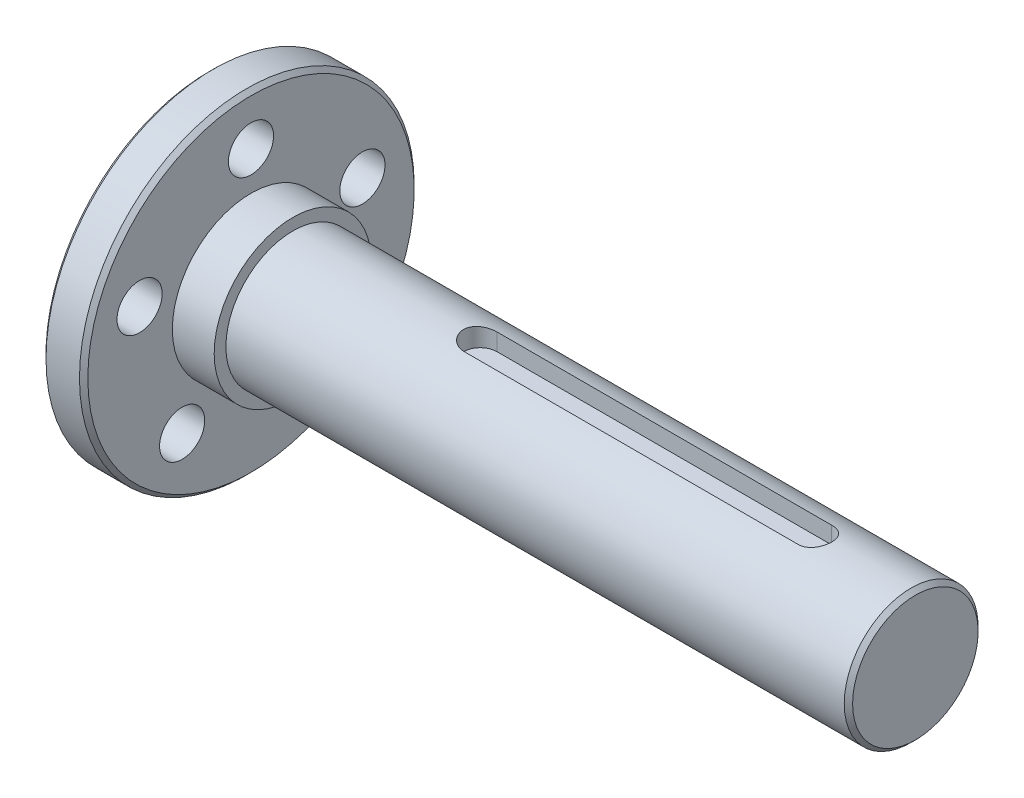
ISO-10303-21;
HEADER;
FILE_DESCRIPTION(('STEP AP214'),'2;1');
FILE_NAME('part.step','',(''),(''),'','','');
FILE_SCHEMA(('AUTOMOTIVE_DESIGN { 1 0 10303 214 1 1 1 1 }'));
ENDSEC;
DATA;
#1=APPLICATION_CONTEXT('core data for automotive mechanical design processes');
#2=APPLICATION_PROTOCOL_DEFINITION('international standard','automotive_design',2000,#1);
#3=PRODUCT_CONTEXT('',#1,'mechanical');
#4=PRODUCT('Part','Part','',(#3));
#5=PRODUCT_RELATED_PRODUCT_CATEGORY('part','',(#4));
#6=PRODUCT_DEFINITION_FORMATION('','',#4);
#7=PRODUCT_DEFINITION_CONTEXT('part definition',#1,'design');
#8=PRODUCT_DEFINITION('design','',#6,#7);
#9=PRODUCT_DEFINITION_SHAPE('','',#8);
#10=(LENGTH_UNIT() NAMED_UNIT(*) SI_UNIT(.MILLI.,.METRE.));
#11=(NAMED_UNIT(*) PLANE_ANGLE_UNIT() SI_UNIT($,.RADIAN.));
#12=(NAMED_UNIT(*) SI_UNIT($,.STERADIAN.) SOLID_ANGLE_UNIT());
#13=UNCERTAINTY_MEASURE_WITH_UNIT(LENGTH_MEASURE(1.E-05),#10,'distance_accuracy_value','');
#14=(GEOMETRIC_REPRESENTATION_CONTEXT(3) GLOBAL_UNCERTAINTY_ASSIGNED_CONTEXT((#13)) GLOBAL_UNIT_ASSIGNED_CONTEXT((#10,
#11,#12)) REPRESENTATION_CONTEXT('',''));
#15=CARTESIAN_POINT('',(0.,0.,0.));
#16=DIRECTION('',(0.,0.,1.));
#17=DIRECTION('',(1.,0.,0.));
#18=AXIS2_PLACEMENT_3D('',#15,#16,#17);
#19=CARTESIAN_POINT('',(5.2,0.,0.));
#20=DIRECTION('',(-1.,0.,0.));
#21=DIRECTION('',(0.,0.,1.));
#22=AXIS2_PLACEMENT_3D('',#19,#20,#21);
#23=PLANE('',#22);
#24=CARTESIAN_POINT('',(5.2,0.,0.));
#25=DIRECTION('',(-1.,0.,0.));
#26=DIRECTION('',(0.,0.,1.));
#27=AXIS2_PLACEMENT_3D('',#24,#25,#26);
#28=CIRCLE('',#27,2.5);
#29=CARTESIAN_POINT('',(5.2,0.,2.5));
#30=VERTEX_POINT('',#29);
#31=EDGE_CURVE('E21',#30,#30,#28,.T.);
#32=ORIENTED_EDGE('',*,*,#31,.T.);
#33=EDGE_LOOP('',(#32));
#34=FACE_BOUND('',#33,.T.);
#35=ADVANCED_FACE('F18',(#34),#23,.T.);
#36=CARTESIAN_POINT('',(5.2,0.,0.));
#37=DIRECTION('',(-1.,0.,0.));
#38=DIRECTION('',(0.,0.,1.));
#39=AXIS2_PLACEMENT_3D('',#36,#37,#38);
#40=CYLINDRICAL_SURFACE('',#39,2.5);
#41=CARTESIAN_POINT('',(0.250000000050932,0.,0.));
#42=DIRECTION('',(-1.,0.,0.));
#43=DIRECTION('',(0.,0.,1.));
#44=AXIS2_PLACEMENT_3D('',#41,#42,#43);
#45=CIRCLE('',#44,2.49999999999773);
#46=CARTESIAN_POINT('',(0.250000000050932,0.,2.49999999999773));
#47=VERTEX_POINT('',#46);
#48=EDGE_CURVE('E112',#47,#47,#45,.T.);
#49=ORIENTED_EDGE('',*,*,#48,.T.);
#50=EDGE_LOOP('',(#49));
#51=FACE_BOUND('',#50,.T.);
#52=ORIENTED_EDGE('',*,*,#31,.F.);
#53=EDGE_LOOP('',(#52));
#54=FACE_BOUND('',#53,.T.);
#55=ADVANCED_FACE('F257',(#51,#54),#40,.F.);
#56=CARTESIAN_POINT('',(0.249999999999995,0.,0.));
#57=DIRECTION('',(1.,0.,0.));
#58=DIRECTION('',(0.,0.,-1.));
#59=AXIS2_PLACEMENT_3D('',#56,#57,#58);
#60=CONICAL_SURFACE('',#59,10.,0.785398163397448);
#61=CARTESIAN_POINT('',(0.,0.,0.));
#62=DIRECTION('',(1.,0.,0.));
#63=DIRECTION('',(0.,0.,-1.));
#64=AXIS2_PLACEMENT_3D('',#61,#62,#63);
#65=CIRCLE('',#64,9.75000000000001);
#66=CARTESIAN_POINT('',(0.,0.,-9.75000000000001));
#67=VERTEX_POINT('',#66);
#68=EDGE_CURVE('E111',#67,#67,#65,.T.);
#69=ORIENTED_EDGE('',*,*,#68,.T.);
#70=EDGE_LOOP('',(#69));
#71=FACE_BOUND('',#70,.T.);
#72=CARTESIAN_POINT('',(0.249999999999995,0.,0.));
#73=DIRECTION('',(-1.,0.,0.));
#74=DIRECTION('',(0.,0.,1.));
#75=AXIS2_PLACEMENT_3D('',#72,#73,#74);
#76=CIRCLE('',#75,10.);
#77=CARTESIAN_POINT('',(0.249999999999995,0.,10.));
#78=VERTEX_POINT('',#77);
#79=EDGE_CURVE('E107',#78,#78,#76,.F.);
#80=ORIENTED_EDGE('',*,*,#79,.F.);
#81=EDGE_LOOP('',(#80));
#82=FACE_BOUND('',#81,.T.);
#83=ADVANCED_FACE('F231',(#71,#82),#60,.T.);
#84=CARTESIAN_POINT('',(-5.6843418860808E-11,0.,0.));
#85=DIRECTION('',(-1.,0.,0.));
#86=DIRECTION('',(0.,0.,1.));
#87=AXIS2_PLACEMENT_3D('',#84,#85,#86);
#88=CONICAL_SURFACE('',#87,2.7500000001055,0.785398163397448);
#89=CARTESIAN_POINT('',(0.,0.,0.));
#90=DIRECTION('',(-1.,0.,0.));
#91=DIRECTION('',(0.,0.,1.));
#92=AXIS2_PLACEMENT_3D('',#89,#90,#91);
#93=CIRCLE('',#92,2.75000000004866);
#94=CARTESIAN_POINT('',(0.,0.,2.75000000004866));
#95=VERTEX_POINT('',#94);
#96=EDGE_CURVE('E106',#95,#95,#93,.T.);
#97=ORIENTED_EDGE('',*,*,#96,.T.);
#98=EDGE_LOOP('',(#97));
#99=FACE_BOUND('',#98,.T.);
#100=ORIENTED_EDGE('',*,*,#48,.F.);
#101=EDGE_LOOP('',(#100));
#102=FACE_BOUND('',#101,.T.);
#103=ADVANCED_FACE('F247',(#99,#102),#88,.F.);
#104=CARTESIAN_POINT('',(2.5,0.,0.));
#105=DIRECTION('',(-1.,0.,0.));
#106=DIRECTION('',(0.,0.,1.));
#107=AXIS2_PLACEMENT_3D('',#104,#105,#106);
#108=CYLINDRICAL_SURFACE('',#107,10.);
#109=ORIENTED_EDGE('',*,*,#79,.T.);
#110=EDGE_LOOP('',(#109));
#111=FACE_BOUND('',#110,.T.);
#112=CARTESIAN_POINT('',(2.25,0.,0.));
#113=DIRECTION('',(-1.,0.,0.));
#114=DIRECTION('',(0.,0.,1.));
#115=AXIS2_PLACEMENT_3D('',#112,#113,#114);
#116=CIRCLE('',#115,10.);
#117=CARTESIAN_POINT('',(2.24999999999999,0.,10.));
#118=VERTEX_POINT('',#117);
#119=EDGE_CURVE('E101',#118,#118,#116,.F.);
#120=ORIENTED_EDGE('',*,*,#119,.F.);
#121=EDGE_LOOP('',(#120));
#122=FACE_BOUND('',#121,.T.);
#123=ADVANCED_FACE('F237',(#111,#122),#108,.T.);
#124=CARTESIAN_POINT('',(0.,0.,0.));
#125=DIRECTION('',(1.,0.,0.));
#126=DIRECTION('',(0.,0.,-1.));
#127=AXIS2_PLACEMENT_3D('',#124,#125,#126);
#128=PLANE('',#127);
#129=CARTESIAN_POINT('',(0.,2.16311896062463,-6.65739561406608));
#130=DIRECTION('',(1.,0.,0.));
#131=DIRECTION('',(0.,0.,-1.));
#132=AXIS2_PLACEMENT_3D('',#129,#130,#131);
#133=CIRCLE('',#132,1.34999999999999);
#134=CARTESIAN_POINT('',(0.,2.16311896062463,-8.00739561406606));
#135=VERTEX_POINT('',#134);
#136=EDGE_CURVE('E207',#135,#135,#133,.T.);
#137=ORIENTED_EDGE('',*,*,#136,.T.);
#138=EDGE_LOOP('',(#137));
#139=FACE_BOUND('',#138,.T.);
#140=CARTESIAN_POINT('',(0.,-5.66311896062463,-4.11449676604731));
#141=DIRECTION('',(1.,0.,0.));
#142=DIRECTION('',(0.,0.,-1.));
#143=AXIS2_PLACEMENT_3D('',#140,#141,#142);
#144=CIRCLE('',#143,1.34999999999999);
#145=CARTESIAN_POINT('',(0.,-5.66311896062463,-5.4644967660473));
#146=VERTEX_POINT('',#145);
#147=EDGE_CURVE('E211',#146,#146,#144,.T.);
#148=ORIENTED_EDGE('',*,*,#147,.T.);
#149=EDGE_LOOP('',(#148));
#150=FACE_BOUND('',#149,.T.);
#151=CARTESIAN_POINT('',(0.,-5.66311896062463,4.11449676604731));
#152=DIRECTION('',(1.,0.,0.));
#153=DIRECTION('',(0.,0.,-1.));
#154=AXIS2_PLACEMENT_3D('',#151,#152,#153);
#155=CIRCLE('',#154,1.34999999999999);
#156=CARTESIAN_POINT('',(0.,-5.66311896062463,2.76449676604732));
#157=VERTEX_POINT('',#156);
#158=EDGE_CURVE('E215',#157,#157,#155,.T.);
#159=ORIENTED_EDGE('',*,*,#158,.T.);
#160=EDGE_LOOP('',(#159));
#161=FACE_BOUND('',#160,.T.);
#162=CARTESIAN_POINT('',(0.,2.16311896062463,6.65739561406607));
#163=DIRECTION('',(1.,0.,0.));
#164=DIRECTION('',(0.,0.,-1.));
#165=AXIS2_PLACEMENT_3D('',#162,#163,#164);
#166=CIRCLE('',#165,1.34999999999999);
#167=CARTESIAN_POINT('',(0.,2.16311896062463,5.30739561406609));
#168=VERTEX_POINT('',#167);
#169=EDGE_CURVE('E219',#168,#168,#166,.T.);
#170=ORIENTED_EDGE('',*,*,#169,.T.);
#171=EDGE_LOOP('',(#170));
#172=FACE_BOUND('',#171,.T.);
#173=CARTESIAN_POINT('',(0.,7.,0.));
#174=DIRECTION('',(1.,0.,0.));
#175=DIRECTION('',(0.,0.,-1.));
#176=AXIS2_PLACEMENT_3D('',#173,#174,#175);
#177=CIRCLE('',#176,1.34999999999999);
#178=CARTESIAN_POINT('',(0.,7.,-1.34999999999999));
#179=VERTEX_POINT('',#178);
#180=EDGE_CURVE('E105',#179,#179,#177,.T.);
#181=ORIENTED_EDGE('',*,*,#180,.T.);
#182=EDGE_LOOP('',(#181));
#183=FACE_BOUND('',#182,.T.);
#184=ORIENTED_EDGE('',*,*,#96,.F.);
#185=EDGE_LOOP('',(#184));
#186=FACE_BOUND('',#185,.T.);
#187=ORIENTED_EDGE('',*,*,#68,.F.);
#188=EDGE_LOOP('',(#187));
#189=FACE_BOUND('',#188,.T.);
#190=ADVANCED_FACE('F234',(#139,#150,#161,#172,#183,#186,#189),#128,.F.);
#191=CARTESIAN_POINT('',(2.24999999999999,0.,0.));
#192=DIRECTION('',(-1.,0.,0.));
#193=DIRECTION('',(0.,0.,1.));
#194=AXIS2_PLACEMENT_3D('',#191,#192,#193);
#195=CONICAL_SURFACE('',#194,10.,0.785398163397449);
#196=ORIENTED_EDGE('',*,*,#119,.T.);
#197=EDGE_LOOP('',(#196));
#198=FACE_BOUND('',#197,.T.);
#199=CARTESIAN_POINT('',(2.5,0.,0.));
#200=DIRECTION('',(-1.,0.,0.));
#201=DIRECTION('',(0.,0.,1.));
#202=AXIS2_PLACEMENT_3D('',#199,#200,#201);
#203=CIRCLE('',#202,9.74999999999999);
#204=CARTESIAN_POINT('',(2.5,0.,9.74999999999999));
#205=VERTEX_POINT('',#204);
#206=EDGE_CURVE('E203',#205,#205,#203,.F.);
#207=ORIENTED_EDGE('',*,*,#206,.F.);
#208=EDGE_LOOP('',(#207));
#209=FACE_BOUND('',#208,.T.);
#210=ADVANCED_FACE('F236',(#198,#209),#195,.T.);
#211=CARTESIAN_POINT('',(2.5,7.,0.));
#212=DIRECTION('',(1.,0.,0.));
#213=DIRECTION('',(0.,0.,-1.));
#214=AXIS2_PLACEMENT_3D('',#211,#212,#213);
#215=CYLINDRICAL_SURFACE('',#214,1.34999999999999);
#216=CARTESIAN_POINT('',(2.5,7.,0.));
#217=DIRECTION('',(1.,0.,0.));
#218=DIRECTION('',(0.,0.,-1.));
#219=AXIS2_PLACEMENT_3D('',#216,#217,#218);
#220=CIRCLE('',#219,1.34999999999999);
#221=CARTESIAN_POINT('',(2.5,7.,-1.34999999999999));
#222=VERTEX_POINT('',#221);
#223=EDGE_CURVE('E199',#222,#222,#220,.F.);
#224=ORIENTED_EDGE('',*,*,#223,.F.);
#225=EDGE_LOOP('',(#224));
#226=FACE_BOUND('',#225,.T.);
#227=ORIENTED_EDGE('',*,*,#180,.F.);
#228=EDGE_LOOP('',(#227));
#229=FACE_BOUND('',#228,.T.);
#230=ADVANCED_FACE('F244',(#226,#229),#215,.F.);
#231=CARTESIAN_POINT('',(2.5,2.16311896062463,6.65739561406607));
#232=DIRECTION('',(1.,0.,0.));
#233=DIRECTION('',(0.,0.,-1.));
#234=AXIS2_PLACEMENT_3D('',#231,#232,#233);
#235=CYLINDRICAL_SURFACE('',#234,1.34999999999999);
#236=CARTESIAN_POINT('',(2.5,2.16311896062463,6.65739561406607));
#237=DIRECTION('',(1.,0.,0.));
#238=DIRECTION('',(0.,0.,-1.));
#239=AXIS2_PLACEMENT_3D('',#236,#237,#238);
#240=CIRCLE('',#239,1.34999999999999);
#241=CARTESIAN_POINT('',(2.5,2.16311896062463,5.30739561406609));
#242=VERTEX_POINT('',#241);
#243=EDGE_CURVE('E195',#242,#242,#240,.F.);
#244=ORIENTED_EDGE('',*,*,#243,.F.);
#245=EDGE_LOOP('',(#244));
#246=FACE_BOUND('',#245,.T.);
#247=ORIENTED_EDGE('',*,*,#169,.F.);
#248=EDGE_LOOP('',(#247));
#249=FACE_BOUND('',#248,.T.);
#250=ADVANCED_FACE('F315',(#246,#249),#235,.F.);
#251=CARTESIAN_POINT('',(2.5,-5.66311896062463,4.11449676604731));
#252=DIRECTION('',(1.,0.,0.));
#253=DIRECTION('',(0.,0.,-1.));
#254=AXIS2_PLACEMENT_3D('',#251,#252,#253);
#255=CYLINDRICAL_SURFACE('',#254,1.34999999999999);
#256=CARTESIAN_POINT('',(2.5,-5.66311896062463,4.11449676604731));
#257=DIRECTION('',(1.,0.,0.));
#258=DIRECTION('',(0.,0.,-1.));
#259=AXIS2_PLACEMENT_3D('',#256,#257,#258);
#260=CIRCLE('',#259,1.34999999999999);
#261=CARTESIAN_POINT('',(2.5,-5.66311896062463,2.76449676604732));
#262=VERTEX_POINT('',#261);
#263=EDGE_CURVE('E191',#262,#262,#260,.F.);
#264=ORIENTED_EDGE('',*,*,#263,.F.);
#265=EDGE_LOOP('',(#264));
#266=FACE_BOUND('',#265,.T.);
#267=ORIENTED_EDGE('',*,*,#158,.F.);
#268=EDGE_LOOP('',(#267));
#269=FACE_BOUND('',#268,.T.);
#270=ADVANCED_FACE('F311',(#266,#269),#255,.F.);
#271=CARTESIAN_POINT('',(2.5,-5.66311896062463,-4.11449676604731));
#272=DIRECTION('',(1.,0.,0.));
#273=DIRECTION('',(0.,0.,-1.));
#274=AXIS2_PLACEMENT_3D('',#271,#272,#273);
#275=CYLINDRICAL_SURFACE('',#274,1.34999999999999);
#276=CARTESIAN_POINT('',(2.5,-5.66311896062463,-4.11449676604731));
#277=DIRECTION('',(1.,0.,0.));
#278=DIRECTION('',(0.,0.,-1.));
#279=AXIS2_PLACEMENT_3D('',#276,#277,#278);
#280=CIRCLE('',#279,1.34999999999999);
#281=CARTESIAN_POINT('',(2.5,-5.66311896062463,-5.4644967660473));
#282=VERTEX_POINT('',#281);
#283=EDGE_CURVE('E187',#282,#282,#280,.F.);
#284=ORIENTED_EDGE('',*,*,#283,.F.);
#285=EDGE_LOOP('',(#284));
#286=FACE_BOUND('',#285,.T.);
#287=ORIENTED_EDGE('',*,*,#147,.F.);
#288=EDGE_LOOP('',(#287));
#289=FACE_BOUND('',#288,.T.);
#290=ADVANCED_FACE('F307',(#286,#289),#275,.F.);
#291=CARTESIAN_POINT('',(2.5,2.16311896062463,-6.65739561406608));
#292=DIRECTION('',(1.,0.,0.));
#293=DIRECTION('',(0.,0.,-1.));
#294=AXIS2_PLACEMENT_3D('',#291,#292,#293);
#295=CYLINDRICAL_SURFACE('',#294,1.34999999999999);
#296=CARTESIAN_POINT('',(2.5,2.16311896062463,-6.65739561406608));
#297=DIRECTION('',(1.,0.,0.));
#298=DIRECTION('',(0.,0.,-1.));
#299=AXIS2_PLACEMENT_3D('',#296,#297,#298);
#300=CIRCLE('',#299,1.34999999999999);
#301=CARTESIAN_POINT('',(2.5,2.16311896062463,-8.00739561406606));
#302=VERTEX_POINT('',#301);
#303=EDGE_CURVE('E86',#302,#302,#300,.F.);
#304=ORIENTED_EDGE('',*,*,#303,.F.);
#305=EDGE_LOOP('',(#304));
#306=FACE_BOUND('',#305,.T.);
#307=ORIENTED_EDGE('',*,*,#136,.F.);
#308=EDGE_LOOP('',(#307));
#309=FACE_BOUND('',#308,.T.);
#310=ADVANCED_FACE('F304',(#306,#309),#295,.F.);
#311=CARTESIAN_POINT('',(0.,2.85,0.));
#312=DIRECTION('',(0.,1.,0.));
#313=DIRECTION('',(0.,0.,1.));
#314=AXIS2_PLACEMENT_3D('',#311,#312,#313);
#315=PLANE('',#314);
#316=CARTESIAN_POINT('',(36.200000022,2.85,0.));
#317=DIRECTION('',(0.,1.,0.));
#318=DIRECTION('',(0.,0.,1.));
#319=AXIS2_PLACEMENT_3D('',#316,#317,#318);
#320=CIRCLE('',#319,1.);
#321=CARTESIAN_POINT('',(36.200000022,2.85,1.));
#322=VERTEX_POINT('',#321);
#323=CARTESIAN_POINT('',(36.200000022,2.85,-1.));
#324=VERTEX_POINT('',#323);
#325=EDGE_CURVE('E68',#322,#324,#320,.T.);
#326=ORIENTED_EDGE('',*,*,#325,.T.);
#327=DIRECTION('',(-1.,0.,0.));
#328=VECTOR('',#327,1.);
#329=CARTESIAN_POINT('',(16.200000022,2.85,-1.));
#330=LINE('',#329,#328);
#331=CARTESIAN_POINT('',(16.200000022,2.85,-1.));
#332=VERTEX_POINT('',#331);
#333=EDGE_CURVE('E71',#324,#332,#330,.T.);
#334=ORIENTED_EDGE('',*,*,#333,.T.);
#335=CARTESIAN_POINT('',(16.200000022,2.85,0.));
#336=DIRECTION('',(0.,1.,0.));
#337=DIRECTION('',(0.,0.,1.));
#338=AXIS2_PLACEMENT_3D('',#335,#336,#337);
#339=CIRCLE('',#338,1.);
#340=CARTESIAN_POINT('',(16.200000022,2.85,1.));
#341=VERTEX_POINT('',#340);
#342=EDGE_CURVE('E179',#332,#341,#339,.T.);
#343=ORIENTED_EDGE('',*,*,#342,.T.);
#344=DIRECTION('',(1.,0.,0.));
#345=VECTOR('',#344,1.);
#346=CARTESIAN_POINT('',(16.200000022,2.85,1.));
#347=LINE('',#346,#345);
#348=EDGE_CURVE('E66',#341,#322,#347,.T.);
#349=ORIENTED_EDGE('',*,*,#348,.T.);
#350=EDGE_LOOP('',(#326,#334,#343,#349));
#351=FACE_BOUND('',#350,.T.);
#352=ADVANCED_FACE('F70',(#351),#315,.T.);
#353=CARTESIAN_POINT('',(2.5,0.,0.));
#354=DIRECTION('',(1.,0.,0.));
#355=DIRECTION('',(0.,0.,-1.));
#356=AXIS2_PLACEMENT_3D('',#353,#354,#355);
#357=PLANE('',#356);
#358=ORIENTED_EDGE('',*,*,#303,.T.);
#359=EDGE_LOOP('',(#358));
#360=FACE_BOUND('',#359,.T.);
#361=ORIENTED_EDGE('',*,*,#283,.T.);
#362=EDGE_LOOP('',(#361));
#363=FACE_BOUND('',#362,.T.);
#364=ORIENTED_EDGE('',*,*,#263,.T.);
#365=EDGE_LOOP('',(#364));
#366=FACE_BOUND('',#365,.T.);
#367=ORIENTED_EDGE('',*,*,#243,.T.);
#368=EDGE_LOOP('',(#367));
#369=FACE_BOUND('',#368,.T.);
#370=ORIENTED_EDGE('',*,*,#223,.T.);
#371=EDGE_LOOP('',(#370));
#372=FACE_BOUND('',#371,.T.);
#373=ORIENTED_EDGE('',*,*,#206,.T.);
#374=EDGE_LOOP('',(#373));
#375=FACE_BOUND('',#374,.T.);
#376=CARTESIAN_POINT('',(2.5,0.,0.));
#377=DIRECTION('',(-1.,0.,0.));
#378=DIRECTION('',(0.,0.,1.));
#379=AXIS2_PLACEMENT_3D('',#376,#377,#378);
#380=CIRCLE('',#379,4.7);
#381=CARTESIAN_POINT('',(2.5,0.,4.7));
#382=VERTEX_POINT('',#381);
#383=EDGE_CURVE('E166',#382,#382,#380,.F.);
#384=ORIENTED_EDGE('',*,*,#383,.F.);
#385=EDGE_LOOP('',(#384));
#386=FACE_BOUND('',#385,.T.);
#387=ADVANCED_FACE('F297',(#360,#363,#366,#369,#372,#375,#386),#357,.T.);
#388=CARTESIAN_POINT('',(42.200000022,0.,0.));
#389=DIRECTION('',(1.,0.,0.));
#390=DIRECTION('',(0.,0.,-1.));
#391=AXIS2_PLACEMENT_3D('',#388,#389,#390);
#392=PLANE('',#391);
#393=CARTESIAN_POINT('',(42.2000000220351,0.,0.));
#394=DIRECTION('',(-1.,0.,0.));
#395=DIRECTION('',(0.,0.,1.));
#396=AXIS2_PLACEMENT_3D('',#393,#394,#395);
#397=CIRCLE('',#396,3.75000000002501);
#398=CARTESIAN_POINT('',(42.2000000220351,0.,3.75000000002501));
#399=VERTEX_POINT('',#398);
#400=EDGE_CURVE('E171',#399,#399,#397,.T.);
#401=ORIENTED_EDGE('',*,*,#400,.F.);
#402=EDGE_LOOP('',(#401));
#403=FACE_BOUND('',#402,.T.);
#404=ADVANCED_FACE('F294',(#403),#392,.T.);
#405=CARTESIAN_POINT('',(16.200000022,-22.0907220343745,-1.));
#406=DIRECTION('',(0.,0.,-1.));
#407=DIRECTION('',(-1.,0.,0.));
#408=AXIS2_PLACEMENT_3D('',#405,#406,#407);
#409=PLANE('',#408);
#410=ORIENTED_EDGE('',*,*,#333,.F.);
#411=DIRECTION('',(0.,1.,0.));
#412=VECTOR('',#411,1.);
#413=CARTESIAN_POINT('',(36.200000022,-22.0907220343745,-1.));
#414=LINE('',#413,#412);
#415=CARTESIAN_POINT('',(36.200000022,3.87298334620742,-1.));
#416=VERTEX_POINT('',#415);
#417=EDGE_CURVE('E77',#324,#416,#414,.T.);
#418=ORIENTED_EDGE('',*,*,#417,.T.);
#419=DIRECTION('',(-1.,0.,0.));
#420=VECTOR('',#419,1.);
#421=CARTESIAN_POINT('',(42.200000022,3.87298334620742,-1.));
#422=LINE('',#421,#420);
#423=CARTESIAN_POINT('',(16.200000022,3.87298334620742,-1.));
#424=VERTEX_POINT('',#423);
#425=EDGE_CURVE('E177',#424,#416,#422,.F.);
#426=ORIENTED_EDGE('',*,*,#425,.F.);
#427=DIRECTION('',(0.,1.,0.));
#428=VECTOR('',#427,1.);
#429=CARTESIAN_POINT('',(16.200000022,-22.0907220343745,-1.));
#430=LINE('',#429,#428);
#431=EDGE_CURVE('E83',#424,#332,#430,.F.);
#432=ORIENTED_EDGE('',*,*,#431,.T.);
#433=EDGE_LOOP('',(#410,#418,#426,#432));
#434=FACE_BOUND('',#433,.T.);
#435=ADVANCED_FACE('F80',(#434),#409,.F.);
#436=CARTESIAN_POINT('',(36.200000022,-22.0907220343745,0.));
#437=DIRECTION('',(0.,1.,0.));
#438=DIRECTION('',(0.,0.,1.));
#439=AXIS2_PLACEMENT_3D('',#436,#437,#438);
#440=CYLINDRICAL_SURFACE('',#439,1.);
#441=ORIENTED_EDGE('',*,*,#325,.F.);
#442=DIRECTION('',(0.,1.,0.));
#443=VECTOR('',#442,1.);
#444=CARTESIAN_POINT('',(36.200000022,-22.0907220343745,1.));
#445=LINE('',#444,#443);
#446=CARTESIAN_POINT('',(36.200000022,3.87298334620742,1.));
#447=VERTEX_POINT('',#446);
#448=EDGE_CURVE('E96',#322,#447,#445,.T.);
#449=ORIENTED_EDGE('',*,*,#448,.T.);
#450=CARTESIAN_POINT('',(36.200000022,3.87298334620742,-1.));
#451=CARTESIAN_POINT('',(36.2276630071065,3.87298148580177,-1.00000033749611));
#452=CARTESIAN_POINT('',(36.2553122850182,3.87328009949471,-0.998851407375366));
#453=CARTESIAN_POINT('',(36.3104040573036,3.87445904774559,-0.994271295395754));
#454=CARTESIAN_POINT('',(36.3378465856871,3.87533928441687,-0.990840497572679));
#455=CARTESIAN_POINT('',(36.4194531952088,3.87881710972054,-0.977175239382526));
#456=CARTESIAN_POINT('',(36.4730564904822,3.88225203148809,-0.963567695172493));
#457=CARTESIAN_POINT('',(36.577124695782,3.89095422588003,-0.927798076247998));
#458=CARTESIAN_POINT('',(36.6275899002129,3.8962213263093,-0.905636805423838));
#459=CARTESIAN_POINT('',(36.7241114706473,3.90799134471939,-0.853415378025867));
#460=CARTESIAN_POINT('',(36.770166649891,3.91449459395647,-0.823353103356933));
#461=CARTESIAN_POINT('',(36.8575439039061,3.92816262398025,-0.755484471828069));
#462=CARTESIAN_POINT('',(36.8987549082455,3.93533791028916,-0.717537268783978));
#463=CARTESIAN_POINT('',(36.9743021114827,3.94945104396193,-0.635275780516234));
#464=CARTESIAN_POINT('',(37.0086372114679,3.95638885322537,-0.590960479478836));
#465=CARTESIAN_POINT('',(37.0699110236186,3.96936182283248,-0.496456899401697));
#466=CARTESIAN_POINT('',(37.096739917984,3.9753830468173,-0.446195340334479));
#467=CARTESIAN_POINT('',(37.1415247561967,3.98572346250589,-0.341702590842923));
#468=CARTESIAN_POINT('',(37.1594824462998,3.99004298914701,-0.287472184083013));
#469=CARTESIAN_POINT('',(37.1856590147774,3.99641900005128,-0.177744108525163));
#470=CARTESIAN_POINT('',(37.1940676944228,3.99851952901301,-0.122294322002861));
#471=CARTESIAN_POINT('',(37.2015033935433,4.00037438150816,-0.0107327756816827));
#472=CARTESIAN_POINT('',(37.2005315921923,4.00012899993445,0.0453789000287023));
#473=CARTESIAN_POINT('',(37.1893700583146,3.99735237365736,0.155352492972094));
#474=CARTESIAN_POINT('',(37.1793854054005,3.99487198677361,0.209236701739853));
#475=CARTESIAN_POINT('',(37.1508113428172,3.98796330636496,0.314538711084338));
#476=CARTESIAN_POINT('',(37.1322215524314,3.98353492665556,0.365956402423985));
#477=CARTESIAN_POINT('',(37.0867987413293,3.97314997761798,0.465407286024537));
#478=CARTESIAN_POINT('',(37.0598926277672,3.96717993827555,0.513405629602247));
#479=CARTESIAN_POINT('',(36.9986568921665,3.95435945541919,0.604276631230014));
#480=CARTESIAN_POINT('',(36.9643261517468,3.94750887933198,0.647148515562288));
#481=CARTESIAN_POINT('',(36.8881211099187,3.93345566022866,0.727769389708489));
#482=CARTESIAN_POINT('',(36.8460683854602,3.92624850477686,0.765349103054125));
#483=CARTESIAN_POINT('',(36.7561701550723,3.91246168284006,0.832969575186235));
#484=CARTESIAN_POINT('',(36.7083230687165,3.90588218842993,0.863008270245059));
#485=CARTESIAN_POINT('',(36.6078544241763,3.89407813586325,0.914804709285958));
#486=CARTESIAN_POINT('',(36.5552085571039,3.88886106009137,0.936517017887265));
#487=CARTESIAN_POINT('',(36.4468830935817,3.88047058807055,0.970702351849826));
#488=CARTESIAN_POINT('',(36.3912081668502,3.87729413761435,0.98318918921213));
#489=CARTESIAN_POINT('',(36.3125426412411,3.87455290681524,0.993904635150938));
#490=CARTESIAN_POINT('',(36.2900803187868,3.8739652311086,0.996190790966708));
#491=CARTESIAN_POINT('',(36.2450822320907,3.87318062488975,0.999236757697394));
#492=CARTESIAN_POINT('',(36.2225466460447,3.87298306219461,0.999999038096045));
#493=CARTESIAN_POINT('',(36.200000022,3.87298334620742,1.));
#494=B_SPLINE_CURVE_WITH_KNOTS('',3,(#450,#451,#452,#453,#454,#455,#456,#457,#458,#459,#460,
#461,#462,#463,#464,#465,#466,#467,#468,#469,#470,#471,#472,#473,#474,#475,#476,#477,#478,#479,
#480,#481,#482,#483,#484,#485,#486,#487,#488,#489,#490,#491,#492,#493),.UNSPECIFIED.,.F.,.F.,(4,
2,2,2,2,2,2,2,2,2,2,2,2,2,2,2,2,2,2,2,2,4),(0.,0.0829365303397623,0.16585910608465,
0.331229963080314,0.496585282091495,0.661984974726751,0.830641897427971,0.999325753539182,
1.17036187098234,1.34136430732424,1.50890481515324,1.67642426256638,1.84022545479275,
2.00403389475838,2.16932509450376,2.33464120964328,2.50441429534541,2.67423379180966,
2.84496720161066,3.01544447539986,3.08315848722649,3.15076267731672),.UNSPECIFIED.);
#495=EDGE_CURVE('E90',#416,#447,#494,.T.);
#496=ORIENTED_EDGE('',*,*,#495,.F.);
#497=ORIENTED_EDGE('',*,*,#417,.F.);
#498=EDGE_LOOP('',(#441,#449,#496,#497));
#499=FACE_BOUND('',#498,.T.);
#500=ADVANCED_FACE('F88',(#499),#440,.F.);
#501=CARTESIAN_POINT('',(16.200000022,-22.0907220343745,1.));
#502=DIRECTION('',(0.,0.,1.));
#503=DIRECTION('',(1.,0.,0.));
#504=AXIS2_PLACEMENT_3D('',#501,#502,#503);
#505=PLANE('',#504);
#506=ORIENTED_EDGE('',*,*,#348,.F.);
#507=DIRECTION('',(0.,1.,0.));
#508=VECTOR('',#507,1.);
#509=CARTESIAN_POINT('',(16.200000022,-22.0907220343745,1.));
#510=LINE('',#509,#508);
#511=CARTESIAN_POINT('',(16.200000022,3.87298334620742,1.));
#512=VERTEX_POINT('',#511);
#513=EDGE_CURVE('E41',#341,#512,#510,.T.);
#514=ORIENTED_EDGE('',*,*,#513,.T.);
#515=DIRECTION('',(-1.,0.,0.));
#516=VECTOR('',#515,1.);
#517=CARTESIAN_POINT('',(42.200000022,3.87298334620742,1.));
#518=LINE('',#517,#516);
#519=EDGE_CURVE('E130',#447,#512,#518,.T.);
#520=ORIENTED_EDGE('',*,*,#519,.F.);
#521=ORIENTED_EDGE('',*,*,#448,.F.);
#522=EDGE_LOOP('',(#506,#514,#520,#521));
#523=FACE_BOUND('',#522,.T.);
#524=ADVANCED_FACE('F161',(#523),#505,.F.);
#525=CARTESIAN_POINT('',(16.200000022,-22.0907220343745,0.));
#526=DIRECTION('',(0.,1.,0.));
#527=DIRECTION('',(0.,0.,1.));
#528=AXIS2_PLACEMENT_3D('',#525,#526,#527);
#529=CYLINDRICAL_SURFACE('',#528,1.);
#530=ORIENTED_EDGE('',*,*,#342,.F.);
#531=ORIENTED_EDGE('',*,*,#431,.F.);
#532=CARTESIAN_POINT('',(16.200000022,3.87298334620742,1.));
#533=CARTESIAN_POINT('',(16.1723370368935,3.87298148580177,1.00000033749611));
#534=CARTESIAN_POINT('',(16.1446877589818,3.87328009949471,0.998851407375366));
#535=CARTESIAN_POINT('',(16.0895959866964,3.87445904774559,0.994271295395754));
#536=CARTESIAN_POINT('',(16.0621534583129,3.87533928441687,0.990840497572679));
#537=CARTESIAN_POINT('',(15.9805468487912,3.87881710972054,0.977175239382527));
#538=CARTESIAN_POINT('',(15.9269435535178,3.88225203148809,0.963567695172493));
#539=CARTESIAN_POINT('',(15.822875348218,3.89095422588003,0.927798076247996));
#540=CARTESIAN_POINT('',(15.7724101437871,3.8962213263093,0.905636805423835));
#541=CARTESIAN_POINT('',(15.6758885733527,3.90799134471939,0.853415378025864));
#542=CARTESIAN_POINT('',(15.629833394109,3.91449459395647,0.823353103356932));
#543=CARTESIAN_POINT('',(15.5424561400939,3.92816262398025,0.755484471828068));
#544=CARTESIAN_POINT('',(15.5012451357545,3.93533791028916,0.717537268783975));
#545=CARTESIAN_POINT('',(15.4256979325173,3.94945104396193,0.63527578051623));
#546=CARTESIAN_POINT('',(15.3913628325321,3.95638885322537,0.590960479478831));
#547=CARTESIAN_POINT('',(15.3300890203814,3.96936182283248,0.496456899401691));
#548=CARTESIAN_POINT('',(15.303260126016,3.9753830468173,0.446195340334474));
#549=CARTESIAN_POINT('',(15.2584752878033,3.98572346250589,0.341702590842919));
#550=CARTESIAN_POINT('',(15.2405175977002,3.99004298914701,0.287472184083009));
#551=CARTESIAN_POINT('',(15.2143410292226,3.99641900005128,0.177744108525159));
#552=CARTESIAN_POINT('',(15.2059323495772,3.99851952901301,0.122294322002857));
#553=CARTESIAN_POINT('',(15.1984966504567,4.00037438150816,0.0107327756816789));
#554=CARTESIAN_POINT('',(15.1994684518077,4.00012899993445,-0.0453789000287064));
#555=CARTESIAN_POINT('',(15.2106299856855,3.99735237365736,-0.155352492972097));
#556=CARTESIAN_POINT('',(15.2206146385995,3.99487198677361,-0.209236701739856));
#557=CARTESIAN_POINT('',(15.2491887011827,3.98796330636496,-0.314538711084341));
#558=CARTESIAN_POINT('',(15.2677784915686,3.98353492665556,-0.365956402423989));
#559=CARTESIAN_POINT('',(15.3132013026707,3.97314997761798,-0.465407286024539));
#560=CARTESIAN_POINT('',(15.3401074162328,3.96717993827555,-0.513405629602248));
#561=CARTESIAN_POINT('',(15.4013431518335,3.95435945541919,-0.604276631230014));
#562=CARTESIAN_POINT('',(15.4356738922532,3.94750887933198,-0.647148515562289));
#563=CARTESIAN_POINT('',(15.5118789340813,3.93345566022866,-0.727769389708491));
#564=CARTESIAN_POINT('',(15.5539316585398,3.92624850477686,-0.765349103054128));
#565=CARTESIAN_POINT('',(15.6438298889277,3.91246168284006,-0.832969575186239));
#566=CARTESIAN_POINT('',(15.6916769752836,3.90588218842993,-0.863008270245063));
#567=CARTESIAN_POINT('',(15.7921456198238,3.89407813586325,-0.914804709285962));
#568=CARTESIAN_POINT('',(15.8447914868961,3.88886106009137,-0.93651701788727));
#569=CARTESIAN_POINT('',(15.9531169504183,3.88047058807055,-0.970702351849828));
#570=CARTESIAN_POINT('',(16.0087918771498,3.87729413761435,-0.983189189212131));
#571=CARTESIAN_POINT('',(16.0874574027589,3.87455290681524,-0.993904635150938));
#572=CARTESIAN_POINT('',(16.1099197252132,3.8739652311086,-0.996190790966708));
#573=CARTESIAN_POINT('',(16.1549178119093,3.87318062488975,-0.999236757697393));
#574=CARTESIAN_POINT('',(16.1774533979553,3.87298306219461,-0.999999038096045));
#575=CARTESIAN_POINT('',(16.200000022,3.87298334620742,-1.));
#576=B_SPLINE_CURVE_WITH_KNOTS('',3,(#532,#533,#534,#535,#536,#537,#538,#539,#540,#541,#542,
#543,#544,#545,#546,#547,#548,#549,#550,#551,#552,#553,#554,#555,#556,#557,#558,#559,#560,#561,
#562,#563,#564,#565,#566,#567,#568,#569,#570,#571,#572,#573,#574,#575),.UNSPECIFIED.,.F.,.F.,(4,
2,2,2,2,2,2,2,2,2,2,2,2,2,2,2,2,2,2,2,2,4),(0.,0.0829365303397693,0.16585910608465,
0.331229963080318,0.496585282091499,0.66198497472675,0.830641897427974,0.999325753539192,
1.17036187098235,1.34136430732424,1.50890481515325,1.67642426256639,1.84022545479276,
2.00403389475838,2.16932509450376,2.33464120964329,2.50441429534542,2.67423379180968,
2.84496720161068,3.01544447539986,3.08315848722648,3.15076267731671),.UNSPECIFIED.);
#577=EDGE_CURVE('E120',#512,#424,#576,.T.);
#578=ORIENTED_EDGE('',*,*,#577,.F.);
#579=ORIENTED_EDGE('',*,*,#513,.F.);
#580=EDGE_LOOP('',(#530,#531,#578,#579));
#581=FACE_BOUND('',#580,.T.);
#582=ADVANCED_FACE('F137',(#581),#529,.F.);
#583=CARTESIAN_POINT('',(5.,0.,0.));
#584=DIRECTION('',(-1.,0.,0.));
#585=DIRECTION('',(0.,0.,1.));
#586=AXIS2_PLACEMENT_3D('',#583,#584,#585);
#587=CYLINDRICAL_SURFACE('',#586,4.7);
#588=ORIENTED_EDGE('',*,*,#383,.T.);
#589=EDGE_LOOP('',(#588));
#590=FACE_BOUND('',#589,.T.);
#591=CARTESIAN_POINT('',(5.,0.,0.));
#592=DIRECTION('',(-1.,0.,0.));
#593=DIRECTION('',(0.,0.,1.));
#594=AXIS2_PLACEMENT_3D('',#591,#592,#593);
#595=CIRCLE('',#594,4.7);
#596=CARTESIAN_POINT('',(5.,0.,4.7));
#597=VERTEX_POINT('',#596);
#598=EDGE_CURVE('E116',#597,#597,#595,.F.);
#599=ORIENTED_EDGE('',*,*,#598,.F.);
#600=EDGE_LOOP('',(#599));
#601=FACE_BOUND('',#600,.T.);
#602=ADVANCED_FACE('F153',(#590,#601),#587,.T.);
#603=CARTESIAN_POINT('',(41.950000022041,0.,0.));
#604=DIRECTION('',(-1.,0.,0.));
#605=DIRECTION('',(0.,0.,1.));
#606=AXIS2_PLACEMENT_3D('',#603,#604,#605);
#607=CONICAL_SURFACE('',#606,3.99999999996226,0.785398163283761);
#608=ORIENTED_EDGE('',*,*,#400,.T.);
#609=EDGE_LOOP('',(#608));
#610=FACE_BOUND('',#609,.T.);
#611=CARTESIAN_POINT('',(41.950000022,0.,0.));
#612=DIRECTION('',(-1.,0.,0.));
#613=DIRECTION('',(0.,0.,1.));
#614=AXIS2_PLACEMENT_3D('',#611,#612,#613);
#615=CIRCLE('',#614,4.);
#616=CARTESIAN_POINT('',(41.950000022,0.,4.));
#617=VERTEX_POINT('',#616);
#618=EDGE_CURVE('E28',#617,#617,#615,.T.);
#619=ORIENTED_EDGE('',*,*,#618,.F.);
#620=EDGE_LOOP('',(#619));
#621=FACE_BOUND('',#620,.T.);
#622=ADVANCED_FACE('F150',(#610,#621),#607,.T.);
#623=CARTESIAN_POINT('',(5.,0.,0.));
#624=DIRECTION('',(1.,0.,0.));
#625=DIRECTION('',(0.,0.,-1.));
#626=AXIS2_PLACEMENT_3D('',#623,#624,#625);
#627=PLANE('',#626);
#628=CARTESIAN_POINT('',(5.,0.,0.));
#629=DIRECTION('',(-1.,0.,0.));
#630=DIRECTION('',(0.,0.,1.));
#631=AXIS2_PLACEMENT_3D('',#628,#629,#630);
#632=CIRCLE('',#631,4.);
#633=CARTESIAN_POINT('',(5.,0.,4.));
#634=VERTEX_POINT('',#633);
#635=EDGE_CURVE('E11',#634,#634,#632,.F.);
#636=ORIENTED_EDGE('',*,*,#635,.F.);
#637=EDGE_LOOP('',(#636));
#638=FACE_BOUND('',#637,.T.);
#639=ORIENTED_EDGE('',*,*,#598,.T.);
#640=EDGE_LOOP('',(#639));
#641=FACE_BOUND('',#640,.T.);
#642=ADVANCED_FACE('F145',(#638,#641),#627,.T.);
#643=CARTESIAN_POINT('',(42.200000022,0.,0.));
#644=DIRECTION('',(-1.,0.,0.));
#645=DIRECTION('',(0.,0.,1.));
#646=AXIS2_PLACEMENT_3D('',#643,#644,#645);
#647=CYLINDRICAL_SURFACE('',#646,4.);
#648=ORIENTED_EDGE('',*,*,#618,.T.);
#649=EDGE_LOOP('',(#648));
#650=FACE_BOUND('',#649,.T.);
#651=ORIENTED_EDGE('',*,*,#635,.T.);
#652=EDGE_LOOP('',(#651));
#653=FACE_BOUND('',#652,.T.);
#654=ORIENTED_EDGE('',*,*,#519,.T.);
#655=ORIENTED_EDGE('',*,*,#577,.T.);
#656=ORIENTED_EDGE('',*,*,#425,.T.);
#657=ORIENTED_EDGE('',*,*,#495,.T.);
#658=EDGE_LOOP('',(#654,#655,#656,#657));
#659=FACE_BOUND('',#658,.T.);
#660=ADVANCED_FACE('F141',(#650,#653,#659),#647,.T.);
#661=CLOSED_SHELL('',(#35,#55,#83,#103,#123,#190,#210,#230,#250,#270,#290,#310,#352,#387,#404,
#435,#500,#524,#582,#602,#622,#642,#660));
#662=MANIFOLD_SOLID_BREP('B1',#661);
#663=ADVANCED_BREP_SHAPE_REPRESENTATION('',(#18,#662),#14);
#664=SHAPE_DEFINITION_REPRESENTATION(#9,#663);
ENDSEC;
END-ISO-10303-21;
